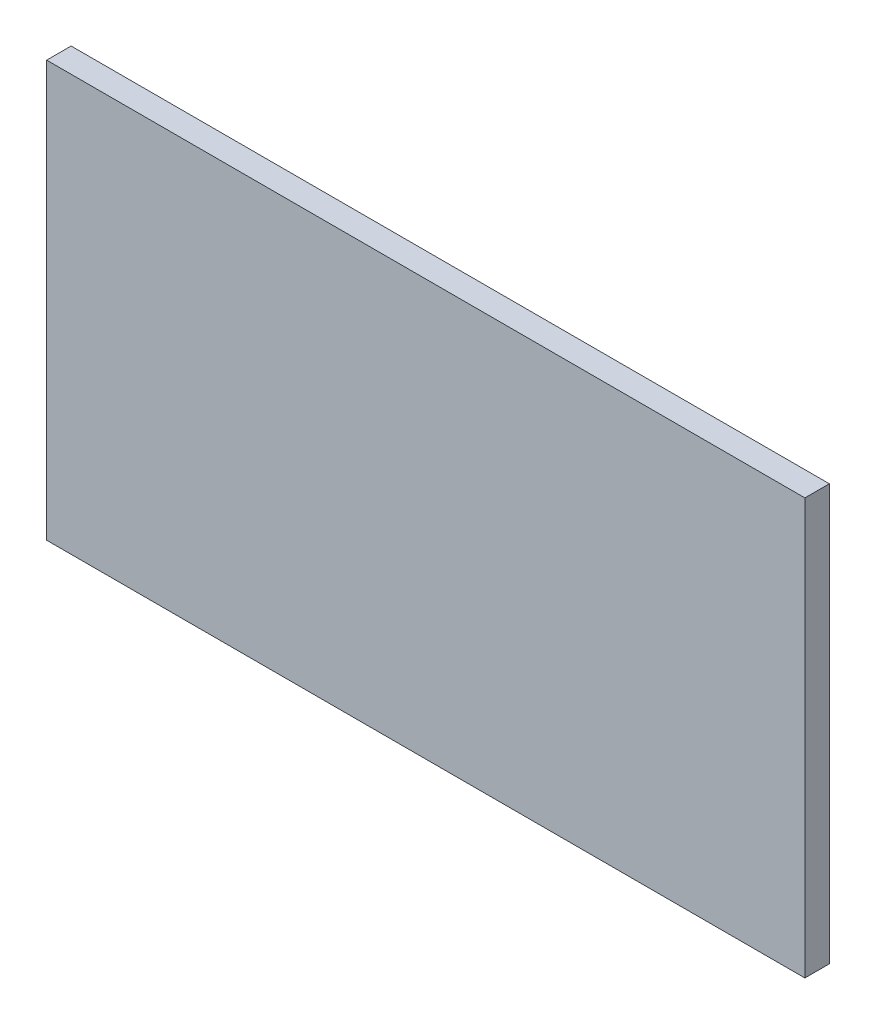
ISO-10303-21;
HEADER;
FILE_DESCRIPTION(('STEP AP214'),'2;1');
FILE_NAME('part.step','',(''),(''),'','','');
FILE_SCHEMA(('AUTOMOTIVE_DESIGN { 1 0 10303 214 1 1 1 1 }'));
ENDSEC;
DATA;
#1=APPLICATION_CONTEXT('core data for automotive mechanical design processes');
#2=APPLICATION_PROTOCOL_DEFINITION('international standard','automotive_design',2000,#1);
#3=PRODUCT_CONTEXT('',#1,'mechanical');
#4=PRODUCT('Part','Part','',(#3));
#5=PRODUCT_RELATED_PRODUCT_CATEGORY('part','',(#4));
#6=PRODUCT_DEFINITION_FORMATION('','',#4);
#7=PRODUCT_DEFINITION_CONTEXT('part definition',#1,'design');
#8=PRODUCT_DEFINITION('design','',#6,#7);
#9=PRODUCT_DEFINITION_SHAPE('','',#8);
#10=(LENGTH_UNIT() NAMED_UNIT(*) SI_UNIT(.MILLI.,.METRE.));
#11=(NAMED_UNIT(*) PLANE_ANGLE_UNIT() SI_UNIT($,.RADIAN.));
#12=(NAMED_UNIT(*) SI_UNIT($,.STERADIAN.) SOLID_ANGLE_UNIT());
#13=UNCERTAINTY_MEASURE_WITH_UNIT(LENGTH_MEASURE(1.E-05),#10,'distance_accuracy_value','');
#14=(GEOMETRIC_REPRESENTATION_CONTEXT(3) GLOBAL_UNCERTAINTY_ASSIGNED_CONTEXT((#13)) GLOBAL_UNIT_ASSIGNED_CONTEXT((#10,
#11,#12)) REPRESENTATION_CONTEXT('',''));
#15=CARTESIAN_POINT('',(0.,0.,0.));
#16=DIRECTION('',(0.,0.,1.));
#17=DIRECTION('',(1.,0.,0.));
#18=AXIS2_PLACEMENT_3D('',#15,#16,#17);
#19=CARTESIAN_POINT('',(114.3,-6.35,6.35));
#20=DIRECTION('',(-1.,0.,0.));
#21=DIRECTION('',(0.,0.,1.));
#22=AXIS2_PLACEMENT_3D('',#19,#20,#21);
#23=PLANE('',#22);
#24=DIRECTION('',(0.,1.,0.));
#25=VECTOR('',#24,1.);
#26=CARTESIAN_POINT('',(114.3,-6.35,0.));
#27=LINE('',#26,#25);
#28=CARTESIAN_POINT('',(114.3,-6.35,0.));
#29=VERTEX_POINT('',#28);
#30=CARTESIAN_POINT('',(114.3,101.6,0.));
#31=VERTEX_POINT('',#30);
#32=EDGE_CURVE('E96',#29,#31,#27,.T.);
#33=ORIENTED_EDGE('',*,*,#32,.T.);
#34=DIRECTION('',(0.,0.,-1.));
#35=VECTOR('',#34,1.);
#36=CARTESIAN_POINT('',(114.3,101.6,6.35));
#37=LINE('',#36,#35);
#38=CARTESIAN_POINT('',(114.3,101.6,6.35));
#39=VERTEX_POINT('',#38);
#40=EDGE_CURVE('E11',#39,#31,#37,.T.);
#41=ORIENTED_EDGE('',*,*,#40,.F.);
#42=DIRECTION('',(0.,1.,0.));
#43=VECTOR('',#42,1.);
#44=CARTESIAN_POINT('',(114.3,-6.35,6.35));
#45=LINE('',#44,#43);
#46=CARTESIAN_POINT('',(114.3,-6.35,6.35));
#47=VERTEX_POINT('',#46);
#48=EDGE_CURVE('E84',#47,#39,#45,.T.);
#49=ORIENTED_EDGE('',*,*,#48,.F.);
#50=DIRECTION('',(0.,0.,-1.));
#51=VECTOR('',#50,1.);
#52=CARTESIAN_POINT('',(114.3,-6.35,6.35));
#53=LINE('',#52,#51);
#54=EDGE_CURVE('E92',#47,#29,#53,.T.);
#55=ORIENTED_EDGE('',*,*,#54,.T.);
#56=EDGE_LOOP('',(#33,#41,#49,#55));
#57=FACE_BOUND('',#56,.T.);
#58=ADVANCED_FACE('F33',(#57),#23,.F.);
#59=CARTESIAN_POINT('',(114.3,101.6,6.35));
#60=DIRECTION('',(0.,-1.,0.));
#61=DIRECTION('',(0.,0.,-1.));
#62=AXIS2_PLACEMENT_3D('',#59,#60,#61);
#63=PLANE('',#62);
#64=DIRECTION('',(-1.,0.,0.));
#65=VECTOR('',#64,1.);
#66=CARTESIAN_POINT('',(114.3,101.6,0.));
#67=LINE('',#66,#65);
#68=CARTESIAN_POINT('',(-82.55,101.6,0.));
#69=VERTEX_POINT('',#68);
#70=EDGE_CURVE('E88',#31,#69,#67,.T.);
#71=ORIENTED_EDGE('',*,*,#70,.T.);
#72=DIRECTION('',(0.,0.,-1.));
#73=VECTOR('',#72,1.);
#74=CARTESIAN_POINT('',(-82.55,101.6,6.35));
#75=LINE('',#74,#73);
#76=CARTESIAN_POINT('',(-82.55,101.6,6.35));
#77=VERTEX_POINT('',#76);
#78=EDGE_CURVE('E41',#77,#69,#75,.T.);
#79=ORIENTED_EDGE('',*,*,#78,.F.);
#80=DIRECTION('',(-1.,0.,0.));
#81=VECTOR('',#80,1.);
#82=CARTESIAN_POINT('',(114.3,101.6,6.35));
#83=LINE('',#82,#81);
#84=EDGE_CURVE('E79',#39,#77,#83,.T.);
#85=ORIENTED_EDGE('',*,*,#84,.F.);
#86=ORIENTED_EDGE('',*,*,#40,.T.);
#87=EDGE_LOOP('',(#71,#79,#85,#86));
#88=FACE_BOUND('',#87,.T.);
#89=ADVANCED_FACE('F87',(#88),#63,.F.);
#90=CARTESIAN_POINT('',(-82.55,-6.35,6.35));
#91=DIRECTION('',(1.,0.,0.));
#92=DIRECTION('',(0.,0.,-1.));
#93=AXIS2_PLACEMENT_3D('',#90,#91,#92);
#94=PLANE('',#93);
#95=DIRECTION('',(0.,-1.,0.));
#96=VECTOR('',#95,1.);
#97=CARTESIAN_POINT('',(-82.55,-6.35,0.));
#98=LINE('',#97,#96);
#99=CARTESIAN_POINT('',(-82.55,-6.35,0.));
#100=VERTEX_POINT('',#99);
#101=EDGE_CURVE('E66',#69,#100,#98,.T.);
#102=ORIENTED_EDGE('',*,*,#101,.T.);
#103=DIRECTION('',(0.,0.,-1.));
#104=VECTOR('',#103,1.);
#105=CARTESIAN_POINT('',(-82.55,-6.35,6.35));
#106=LINE('',#105,#104);
#107=CARTESIAN_POINT('',(-82.55,-6.35,6.35));
#108=VERTEX_POINT('',#107);
#109=EDGE_CURVE('E89',#108,#100,#106,.T.);
#110=ORIENTED_EDGE('',*,*,#109,.F.);
#111=DIRECTION('',(0.,-1.,0.));
#112=VECTOR('',#111,1.);
#113=CARTESIAN_POINT('',(-82.55,-6.35,6.35));
#114=LINE('',#113,#112);
#115=EDGE_CURVE('E82',#77,#108,#114,.T.);
#116=ORIENTED_EDGE('',*,*,#115,.F.);
#117=ORIENTED_EDGE('',*,*,#78,.T.);
#118=EDGE_LOOP('',(#102,#110,#116,#117));
#119=FACE_BOUND('',#118,.T.);
#120=ADVANCED_FACE('F90',(#119),#94,.F.);
#121=CARTESIAN_POINT('',(114.3,-6.35,6.35));
#122=DIRECTION('',(0.,1.,0.));
#123=DIRECTION('',(0.,0.,1.));
#124=AXIS2_PLACEMENT_3D('',#121,#122,#123);
#125=PLANE('',#124);
#126=DIRECTION('',(1.,0.,0.));
#127=VECTOR('',#126,1.);
#128=CARTESIAN_POINT('',(114.3,-6.35,0.));
#129=LINE('',#128,#127);
#130=EDGE_CURVE('E72',#100,#29,#129,.T.);
#131=ORIENTED_EDGE('',*,*,#130,.T.);
#132=ORIENTED_EDGE('',*,*,#54,.F.);
#133=DIRECTION('',(1.,0.,0.));
#134=VECTOR('',#133,1.);
#135=CARTESIAN_POINT('',(114.3,-6.35,6.35));
#136=LINE('',#135,#134);
#137=EDGE_CURVE('E49',#108,#47,#136,.T.);
#138=ORIENTED_EDGE('',*,*,#137,.F.);
#139=ORIENTED_EDGE('',*,*,#109,.T.);
#140=EDGE_LOOP('',(#131,#132,#138,#139));
#141=FACE_BOUND('',#140,.T.);
#142=ADVANCED_FACE('F103',(#141),#125,.F.);
#143=CARTESIAN_POINT('',(0.,0.,6.35));
#144=DIRECTION('',(0.,0.,1.));
#145=DIRECTION('',(1.,0.,0.));
#146=AXIS2_PLACEMENT_3D('',#143,#144,#145);
#147=PLANE('',#146);
#148=ORIENTED_EDGE('',*,*,#48,.T.);
#149=ORIENTED_EDGE('',*,*,#84,.T.);
#150=ORIENTED_EDGE('',*,*,#115,.T.);
#151=ORIENTED_EDGE('',*,*,#137,.T.);
#152=EDGE_LOOP('',(#148,#149,#150,#151));
#153=FACE_BOUND('',#152,.T.);
#154=ADVANCED_FACE('F80',(#153),#147,.T.);
#155=CARTESIAN_POINT('',(0.,0.,0.));
#156=DIRECTION('',(0.,0.,1.));
#157=DIRECTION('',(1.,0.,0.));
#158=AXIS2_PLACEMENT_3D('',#155,#156,#157);
#159=PLANE('',#158);
#160=ORIENTED_EDGE('',*,*,#32,.F.);
#161=ORIENTED_EDGE('',*,*,#130,.F.);
#162=ORIENTED_EDGE('',*,*,#101,.F.);
#163=ORIENTED_EDGE('',*,*,#70,.F.);
#164=EDGE_LOOP('',(#160,#161,#162,#163));
#165=FACE_BOUND('',#164,.T.);
#166=ADVANCED_FACE('F106',(#165),#159,.F.);
#167=CLOSED_SHELL('',(#58,#89,#120,#142,#154,#166));
#168=MANIFOLD_SOLID_BREP('B2',#167);
#169=ADVANCED_BREP_SHAPE_REPRESENTATION('',(#18,#168),#14);
#170=SHAPE_DEFINITION_REPRESENTATION(#9,#169);
ENDSEC;
END-ISO-10303-21;
